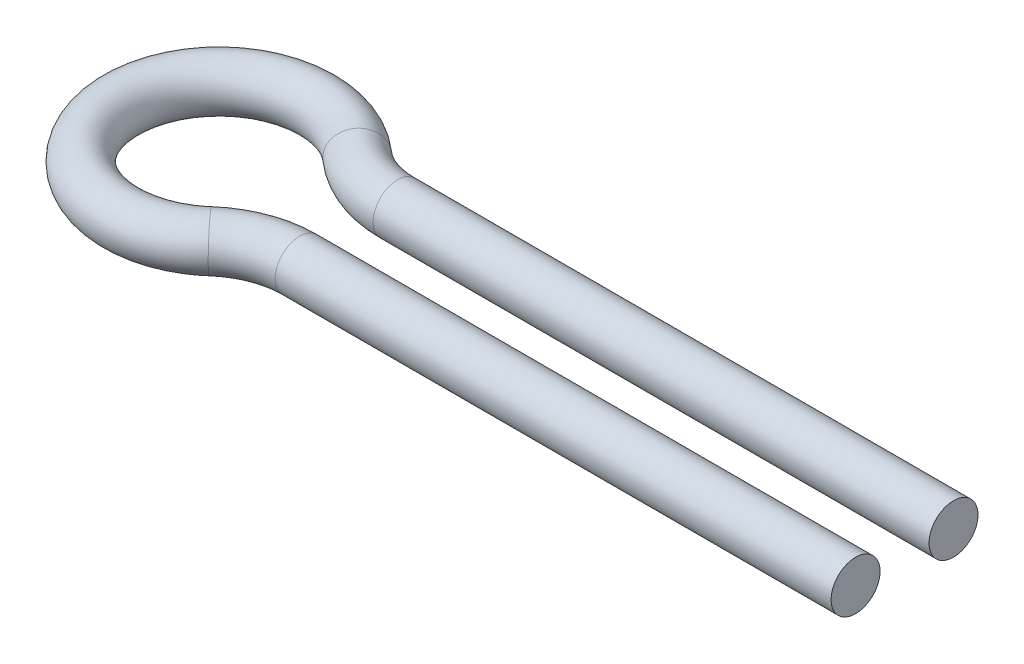
ISO-10303-21;
HEADER;
FILE_DESCRIPTION(('STEP AP214'),'2;1');
FILE_NAME('part.step','',(''),(''),'','','');
FILE_SCHEMA(('AUTOMOTIVE_DESIGN { 1 0 10303 214 1 1 1 1 }'));
ENDSEC;
DATA;
#1=APPLICATION_CONTEXT('core data for automotive mechanical design processes');
#2=APPLICATION_PROTOCOL_DEFINITION('international standard','automotive_design',2000,#1);
#3=PRODUCT_CONTEXT('',#1,'mechanical');
#4=PRODUCT('Part','Part','',(#3));
#5=PRODUCT_RELATED_PRODUCT_CATEGORY('part','',(#4));
#6=PRODUCT_DEFINITION_FORMATION('','',#4);
#7=PRODUCT_DEFINITION_CONTEXT('part definition',#1,'design');
#8=PRODUCT_DEFINITION('design','',#6,#7);
#9=PRODUCT_DEFINITION_SHAPE('','',#8);
#10=(LENGTH_UNIT() NAMED_UNIT(*) SI_UNIT(.MILLI.,.METRE.));
#11=(NAMED_UNIT(*) PLANE_ANGLE_UNIT() SI_UNIT($,.RADIAN.));
#12=(NAMED_UNIT(*) SI_UNIT($,.STERADIAN.) SOLID_ANGLE_UNIT());
#13=UNCERTAINTY_MEASURE_WITH_UNIT(LENGTH_MEASURE(1.E-05),#10,'distance_accuracy_value','');
#14=(GEOMETRIC_REPRESENTATION_CONTEXT(3) GLOBAL_UNCERTAINTY_ASSIGNED_CONTEXT((#13)) GLOBAL_UNIT_ASSIGNED_CONTEXT((#10,
#11,#12)) REPRESENTATION_CONTEXT('',''));
#15=CARTESIAN_POINT('',(0.,0.,0.));
#16=DIRECTION('',(0.,0.,1.));
#17=DIRECTION('',(1.,0.,0.));
#18=AXIS2_PLACEMENT_3D('',#15,#16,#17);
#19=CARTESIAN_POINT('',(70.,0.,-5.));
#20=DIRECTION('',(1.,0.,0.));
#21=DIRECTION('',(0.,0.,-1.));
#22=AXIS2_PLACEMENT_3D('',#19,#20,#21);
#23=PLANE('',#22);
#24=CARTESIAN_POINT('',(70.,0.,-5.));
#25=DIRECTION('',(1.,0.,0.));
#26=DIRECTION('',(0.,0.,-1.));
#27=AXIS2_PLACEMENT_3D('',#24,#25,#26);
#28=CIRCLE('',#27,2.5);
#29=CARTESIAN_POINT('',(70.,0.,-7.5));
#30=VERTEX_POINT('',#29);
#31=EDGE_CURVE('E55',#30,#30,#28,.T.);
#32=ORIENTED_EDGE('',*,*,#31,.T.);
#33=EDGE_LOOP('',(#32));
#34=FACE_BOUND('',#33,.T.);
#35=ADVANCED_FACE('F33',(#34),#23,.T.);
#36=CARTESIAN_POINT('',(70.,0.,5.));
#37=DIRECTION('',(-1.,0.,0.));
#38=DIRECTION('',(0.,0.,1.));
#39=AXIS2_PLACEMENT_3D('',#36,#37,#38);
#40=PLANE('',#39);
#41=CARTESIAN_POINT('',(70.,0.,5.));
#42=DIRECTION('',(-1.,0.,0.));
#43=DIRECTION('',(0.,0.,1.));
#44=AXIS2_PLACEMENT_3D('',#41,#42,#43);
#45=CIRCLE('',#44,2.5);
#46=CARTESIAN_POINT('',(70.,0.,7.5));
#47=VERTEX_POINT('',#46);
#48=EDGE_CURVE('E10',#47,#47,#45,.T.);
#49=ORIENTED_EDGE('',*,*,#48,.F.);
#50=EDGE_LOOP('',(#49));
#51=FACE_BOUND('',#50,.T.);
#52=ADVANCED_FACE('F63',(#51),#40,.F.);
#53=CARTESIAN_POINT('',(70.,0.,-5.));
#54=DIRECTION('',(-1.,0.,0.));
#55=DIRECTION('',(0.,0.,1.));
#56=AXIS2_PLACEMENT_3D('',#53,#54,#55);
#57=CYLINDRICAL_SURFACE('',#56,2.5);
#58=CARTESIAN_POINT('',(13.228756555323,0.,-5.));
#59=DIRECTION('',(1.,0.,0.));
#60=DIRECTION('',(0.,0.,-1.));
#61=AXIS2_PLACEMENT_3D('',#58,#59,#60);
#62=CIRCLE('',#61,2.5);
#63=CARTESIAN_POINT('',(13.228756555323,0.,-2.5));
#64=VERTEX_POINT('',#63);
#65=EDGE_CURVE('E52',#64,#64,#62,.T.);
#66=ORIENTED_EDGE('',*,*,#65,.T.);
#67=EDGE_LOOP('',(#66));
#68=FACE_BOUND('',#67,.T.);
#69=ORIENTED_EDGE('',*,*,#31,.F.);
#70=EDGE_LOOP('',(#69));
#71=FACE_BOUND('',#70,.T.);
#72=ADVANCED_FACE('F60',(#68,#71),#57,.T.);
#73=CARTESIAN_POINT('',(13.228756555323,0.,-15.));
#74=DIRECTION('',(0.,-1.,0.));
#75=DIRECTION('',(0.,0.,-1.));
#76=AXIS2_PLACEMENT_3D('',#73,#74,#75);
#77=TOROIDAL_SURFACE('',#76,10.,2.5);
#78=CARTESIAN_POINT('',(6.61437827766148,0.,-7.50000000000001));
#79=DIRECTION('',(0.75,0.,0.661437827766148));
#80=DIRECTION('',(0.661437827766148,0.,-0.75));
#81=AXIS2_PLACEMENT_3D('',#78,#79,#80);
#82=CIRCLE('',#81,2.5);
#83=CARTESIAN_POINT('',(4.96078370824611,0.,-5.62500000000001));
#84=VERTEX_POINT('',#83);
#85=EDGE_CURVE('E47',#84,#84,#82,.T.);
#86=CARTESIAN_POINT('',(13.228756555323,0.,-15.));
#87=DIRECTION('',(0.,-1.,0.));
#88=DIRECTION('',(0.,0.,-1.));
#89=AXIS2_PLACEMENT_3D('',#86,#87,#88);
#90=CIRCLE('',#89,12.5);
#91=EDGE_CURVE('',#64,#84,#90,.T.);
#92=ORIENTED_EDGE('',*,*,#65,.F.);
#93=ORIENTED_EDGE('',*,*,#85,.T.);
#94=ORIENTED_EDGE('',*,*,#91,.T.);
#95=ORIENTED_EDGE('',*,*,#91,.F.);
#96=EDGE_LOOP('',(#92,#94,#93,#95));
#97=FACE_BOUND('',#96,.T.);
#98=ADVANCED_FACE('F62',(#97),#77,.T.);
#99=CARTESIAN_POINT('',(0.,0.,0.));
#100=DIRECTION('',(0.,1.,0.));
#101=DIRECTION('',(0.,0.,1.));
#102=AXIS2_PLACEMENT_3D('',#99,#100,#101);
#103=TOROIDAL_SURFACE('',#102,10.,2.5);
#104=CARTESIAN_POINT('',(6.61437827766148,0.,7.5));
#105=DIRECTION('',(-0.75,0.,0.661437827766148));
#106=DIRECTION('',(0.661437827766148,0.,0.75));
#107=AXIS2_PLACEMENT_3D('',#104,#105,#106);
#108=CIRCLE('',#107,2.5);
#109=CARTESIAN_POINT('',(4.96078370824611,0.,5.62500000000001));
#110=VERTEX_POINT('',#109);
#111=EDGE_CURVE('E43',#110,#110,#108,.T.);
#112=ORIENTED_EDGE('',*,*,#111,.T.);
#113=EDGE_LOOP('',(#112));
#114=FACE_BOUND('',#113,.T.);
#115=ORIENTED_EDGE('',*,*,#85,.F.);
#116=EDGE_LOOP('',(#115));
#117=FACE_BOUND('',#116,.T.);
#118=ADVANCED_FACE('F70',(#114,#117),#103,.T.);
#119=CARTESIAN_POINT('',(13.228756555323,0.,15.));
#120=DIRECTION('',(0.,-1.,0.));
#121=DIRECTION('',(0.,0.,-1.));
#122=AXIS2_PLACEMENT_3D('',#119,#120,#121);
#123=TOROIDAL_SURFACE('',#122,10.,2.5);
#124=CARTESIAN_POINT('',(13.228756555323,0.,5.));
#125=DIRECTION('',(-1.,0.,0.));
#126=DIRECTION('',(0.,0.,1.));
#127=AXIS2_PLACEMENT_3D('',#124,#125,#126);
#128=CIRCLE('',#127,2.5);
#129=CARTESIAN_POINT('',(13.228756555323,0.,2.5));
#130=VERTEX_POINT('',#129);
#131=EDGE_CURVE('E39',#130,#130,#128,.T.);
#132=CARTESIAN_POINT('',(13.228756555323,0.,15.));
#133=DIRECTION('',(0.,-1.,0.));
#134=DIRECTION('',(0.,0.,-1.));
#135=AXIS2_PLACEMENT_3D('',#132,#133,#134);
#136=CIRCLE('',#135,12.5);
#137=EDGE_CURVE('',#110,#130,#136,.T.);
#138=ORIENTED_EDGE('',*,*,#111,.F.);
#139=ORIENTED_EDGE('',*,*,#131,.T.);
#140=ORIENTED_EDGE('',*,*,#137,.T.);
#141=ORIENTED_EDGE('',*,*,#137,.F.);
#142=EDGE_LOOP('',(#138,#140,#139,#141));
#143=FACE_BOUND('',#142,.T.);
#144=ADVANCED_FACE('F76',(#143),#123,.T.);
#145=CARTESIAN_POINT('',(13.228756555323,0.,5.));
#146=DIRECTION('',(1.,0.,0.));
#147=DIRECTION('',(0.,0.,-1.));
#148=AXIS2_PLACEMENT_3D('',#145,#146,#147);
#149=CYLINDRICAL_SURFACE('',#148,2.5);
#150=ORIENTED_EDGE('',*,*,#48,.T.);
#151=EDGE_LOOP('',(#150));
#152=FACE_BOUND('',#151,.T.);
#153=ORIENTED_EDGE('',*,*,#131,.F.);
#154=EDGE_LOOP('',(#153));
#155=FACE_BOUND('',#154,.T.);
#156=ADVANCED_FACE('F74',(#152,#155),#149,.T.);
#157=CLOSED_SHELL('',(#35,#52,#72,#98,#118,#144,#156));
#158=MANIFOLD_SOLID_BREP('B2',#157);
#159=ADVANCED_BREP_SHAPE_REPRESENTATION('',(#18,#158),#14);
#160=SHAPE_DEFINITION_REPRESENTATION(#9,#159);
ENDSEC;
END-ISO-10303-21;
